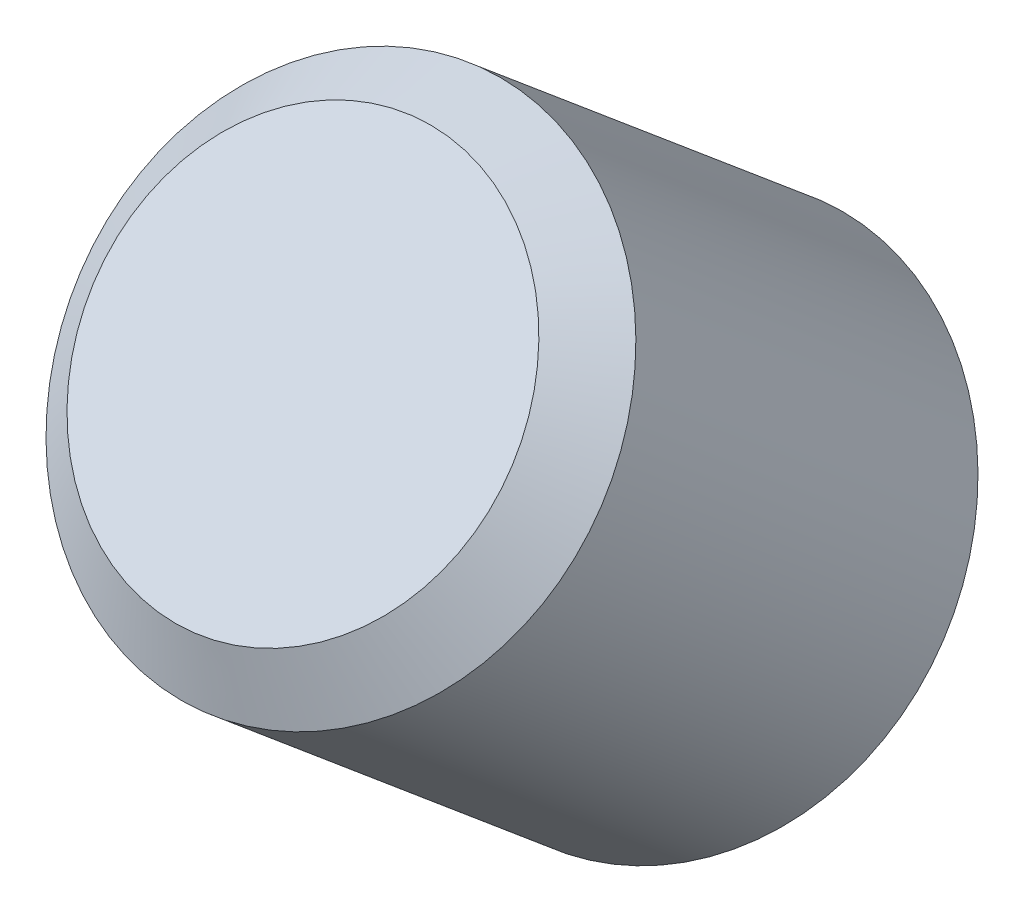
ISO-10303-21;
HEADER;
FILE_DESCRIPTION(('STEP AP214'),'2;1');
FILE_NAME('part.step','',(''),(''),'','','');
FILE_SCHEMA(('AUTOMOTIVE_DESIGN { 1 0 10303 214 1 1 1 1 }'));
ENDSEC;
DATA;
#1=APPLICATION_CONTEXT('core data for automotive mechanical design processes');
#2=APPLICATION_PROTOCOL_DEFINITION('international standard','automotive_design',2000,#1);
#3=PRODUCT_CONTEXT('',#1,'mechanical');
#4=PRODUCT('Part','Part','',(#3));
#5=PRODUCT_RELATED_PRODUCT_CATEGORY('part','',(#4));
#6=PRODUCT_DEFINITION_FORMATION('','',#4);
#7=PRODUCT_DEFINITION_CONTEXT('part definition',#1,'design');
#8=PRODUCT_DEFINITION('design','',#6,#7);
#9=PRODUCT_DEFINITION_SHAPE('','',#8);
#10=(LENGTH_UNIT() NAMED_UNIT(*) SI_UNIT(.MILLI.,.METRE.));
#11=(NAMED_UNIT(*) PLANE_ANGLE_UNIT() SI_UNIT($,.RADIAN.));
#12=(NAMED_UNIT(*) SI_UNIT($,.STERADIAN.) SOLID_ANGLE_UNIT());
#13=UNCERTAINTY_MEASURE_WITH_UNIT(LENGTH_MEASURE(1.E-05),#10,'distance_accuracy_value','');
#14=(GEOMETRIC_REPRESENTATION_CONTEXT(3) GLOBAL_UNCERTAINTY_ASSIGNED_CONTEXT((#13)) GLOBAL_UNIT_ASSIGNED_CONTEXT((#10,
#11,#12)) REPRESENTATION_CONTEXT('',''));
#15=CARTESIAN_POINT('',(0.,0.,0.));
#16=DIRECTION('',(0.,0.,1.));
#17=DIRECTION('',(1.,0.,0.));
#18=AXIS2_PLACEMENT_3D('',#15,#16,#17);
#19=CARTESIAN_POINT('',(37.1840011378351,58.5071937703798,-39.8184459232381));
#20=DIRECTION('',(0.,0.642787609686543,0.766044443118975));
#21=DIRECTION('',(0.,-0.766044443118975,0.642787609686543));
#22=AXIS2_PLACEMENT_3D('',#19,#20,#21);
#23=PLANE('',#22);
#24=CARTESIAN_POINT('',(37.1840011378351,58.5071937703798,-39.8184459232381));
#25=DIRECTION('',(0.,0.642787609686543,0.766044443118975));
#26=DIRECTION('',(0.,-0.766044443118975,0.642787609686543));
#27=AXIS2_PLACEMENT_3D('',#24,#25,#26);
#28=CIRCLE('',#27,3.99999999999999);
#29=CARTESIAN_POINT('',(37.1840011378351,55.4430159979039,-37.2472954844919));
#30=VERTEX_POINT('',#29);
#31=EDGE_CURVE('E59',#30,#30,#28,.F.);
#32=ORIENTED_EDGE('',*,*,#31,.T.);
#33=EDGE_LOOP('',(#32));
#34=FACE_BOUND('',#33,.T.);
#35=CARTESIAN_POINT('',(37.1840011378351,58.5071937703798,-39.8184459232381));
#36=DIRECTION('',(0.,0.642787609686543,0.766044443118975));
#37=DIRECTION('',(0.,-0.766044443118975,0.642787609686543));
#38=AXIS2_PLACEMENT_3D('',#35,#36,#37);
#39=CIRCLE('',#38,3.10000022417708);
#40=CARTESIAN_POINT('',(38.7840011378351,60.5411826203742,-41.5251652170871));
#41=VERTEX_POINT('',#40);
#42=CARTESIAN_POINT('',(38.7840011378351,56.4732049203854,-38.1117266293891));
#43=VERTEX_POINT('',#42);
#44=EDGE_CURVE('E76',#41,#43,#39,.T.);
#45=ORIENTED_EDGE('',*,*,#44,.T.);
#46=DIRECTION('',(0.,0.766044443118975,-0.642787609686543));
#47=VECTOR('',#46,1.);
#48=CARTESIAN_POINT('',(38.7840011378351,56.4732049203854,-38.1117266293891));
#49=LINE('',#48,#47);
#50=EDGE_CURVE('E87',#43,#41,#49,.T.);
#51=ORIENTED_EDGE('',*,*,#50,.T.);
#52=EDGE_LOOP('',(#45,#51));
#53=FACE_BOUND('',#52,.T.);
#54=ADVANCED_FACE('F49',(#34,#53),#23,.F.);
#55=CARTESIAN_POINT('',(37.1840011378351,64.9350698672452,-32.1580014920484));
#56=DIRECTION('',(0.,-0.642787609686543,-0.766044443118975));
#57=DIRECTION('',(0.,0.766044443118975,-0.642787609686543));
#58=AXIS2_PLACEMENT_3D('',#55,#56,#57);
#59=CYLINDRICAL_SURFACE('',#58,5.);
#60=CARTESIAN_POINT('',(37.1840011378351,59.1499813800663,-39.0524014801191));
#61=DIRECTION('',(0.,0.642787609686544,0.766044443118974));
#62=DIRECTION('',(0.,-0.766044443118974,0.642787609686544));
#63=AXIS2_PLACEMENT_3D('',#60,#61,#62);
#64=CIRCLE('',#63,5.);
#65=CARTESIAN_POINT('',(37.1840011378351,55.3197591644715,-35.8384634316864));
#66=VERTEX_POINT('',#65);
#67=EDGE_CURVE('E108',#66,#66,#64,.T.);
#68=ORIENTED_EDGE('',*,*,#67,.T.);
#69=EDGE_LOOP('',(#68));
#70=FACE_BOUND('',#69,.T.);
#71=CARTESIAN_POINT('',(37.1840011378351,64.9350698672453,-32.1580014920483));
#72=DIRECTION('',(0.,0.642787609686543,0.766044443118975));
#73=DIRECTION('',(0.,-0.766044443118975,0.642787609686543));
#74=AXIS2_PLACEMENT_3D('',#71,#72,#73);
#75=CIRCLE('',#74,5.);
#76=CARTESIAN_POINT('',(37.1840011378351,68.7652920828402,-35.371939540481));
#77=VERTEX_POINT('',#76);
#78=EDGE_CURVE('E100',#77,#77,#75,.F.);
#79=ORIENTED_EDGE('',*,*,#78,.T.);
#80=EDGE_LOOP('',(#79));
#81=FACE_BOUND('',#80,.T.);
#82=ADVANCED_FACE('F124',(#70,#81),#59,.T.);
#83=CARTESIAN_POINT('',(37.1840011378351,64.9350698672452,-32.1580014920484));
#84=DIRECTION('',(0.,-0.642787609686543,-0.766044443118975));
#85=DIRECTION('',(0.,0.766044443118975,-0.642787609686543));
#86=AXIS2_PLACEMENT_3D('',#83,#84,#85);
#87=CYLINDRICAL_SURFACE('',#86,3.10000022417708);
#88=ORIENTED_EDGE('',*,*,#44,.F.);
#89=DIRECTION('',(0.,-0.642787609686543,-0.766044443118975));
#90=VECTOR('',#89,1.);
#91=CARTESIAN_POINT('',(38.7840011378351,66.9690587172396,-33.8647207858974));
#92=LINE('',#91,#90);
#93=CARTESIAN_POINT('',(38.7840011378351,66.9690587172396,-33.8647207858974));
#94=VERTEX_POINT('',#93);
#95=EDGE_CURVE('E91',#94,#41,#92,.T.);
#96=ORIENTED_EDGE('',*,*,#95,.F.);
#97=CARTESIAN_POINT('',(37.1840011378351,64.9350698672452,-32.1580014920484));
#98=DIRECTION('',(0.,0.642787609686543,0.766044443118975));
#99=DIRECTION('',(0.,-0.766044443118975,0.642787609686543));
#100=AXIS2_PLACEMENT_3D('',#97,#98,#99);
#101=CIRCLE('',#100,3.10000022417708);
#102=CARTESIAN_POINT('',(38.7840011378351,62.9010810172509,-30.4512821981994));
#103=VERTEX_POINT('',#102);
#104=EDGE_CURVE('E84',#94,#103,#101,.T.);
#105=ORIENTED_EDGE('',*,*,#104,.T.);
#106=DIRECTION('',(0.,-0.642787609686543,-0.766044443118975));
#107=VECTOR('',#106,1.);
#108=CARTESIAN_POINT('',(38.7840011378351,62.9010810172509,-30.4512821981994));
#109=LINE('',#108,#107);
#110=EDGE_CURVE('E93',#103,#43,#109,.T.);
#111=ORIENTED_EDGE('',*,*,#110,.T.);
#112=EDGE_LOOP('',(#88,#96,#105,#111));
#113=FACE_BOUND('',#112,.T.);
#114=ADVANCED_FACE('F96',(#113),#87,.F.);
#115=CARTESIAN_POINT('',(38.7840011378351,62.9010810172509,-30.4512821981994));
#116=DIRECTION('',(-1.,0.,0.));
#117=DIRECTION('',(0.,0.,1.));
#118=AXIS2_PLACEMENT_3D('',#115,#116,#117);
#119=PLANE('',#118);
#120=ORIENTED_EDGE('',*,*,#50,.F.);
#121=ORIENTED_EDGE('',*,*,#110,.F.);
#122=DIRECTION('',(0.,0.766044443118975,-0.642787609686543));
#123=VECTOR('',#122,1.);
#124=CARTESIAN_POINT('',(38.7840011378351,62.9010810172509,-30.4512821981994));
#125=LINE('',#124,#123);
#126=EDGE_CURVE('E68',#103,#94,#125,.T.);
#127=ORIENTED_EDGE('',*,*,#126,.T.);
#128=ORIENTED_EDGE('',*,*,#95,.T.);
#129=EDGE_LOOP('',(#120,#121,#127,#128));
#130=FACE_BOUND('',#129,.T.);
#131=ADVANCED_FACE('F90',(#130),#119,.T.);
#132=CARTESIAN_POINT('',(37.1840011378351,64.9350698672452,-32.1580014920484));
#133=DIRECTION('',(0.,0.642787609686543,0.766044443118975));
#134=DIRECTION('',(0.,-0.766044443118975,0.642787609686543));
#135=AXIS2_PLACEMENT_3D('',#132,#133,#134);
#136=PLANE('',#135);
#137=ORIENTED_EDGE('',*,*,#126,.F.);
#138=ORIENTED_EDGE('',*,*,#104,.F.);
#139=EDGE_LOOP('',(#137,#138));
#140=FACE_BOUND('',#139,.T.);
#141=ADVANCED_FACE('F85',(#140),#136,.F.);
#142=CARTESIAN_POINT('',(37.1840011378351,65.5778574769318,-31.3919570489294));
#143=DIRECTION('',(0.,0.642787609686543,0.766044443118975));
#144=DIRECTION('',(0.,-0.766044443118975,0.642787609686543));
#145=AXIS2_PLACEMENT_3D('',#142,#143,#144);
#146=PLANE('',#145);
#147=CARTESIAN_POINT('',(37.1840011378351,65.5778574769318,-31.3919570489294));
#148=DIRECTION('',(0.,0.642787609686543,0.766044443118975));
#149=DIRECTION('',(0.,-0.766044443118975,0.642787609686543));
#150=AXIS2_PLACEMENT_3D('',#147,#148,#149);
#151=CIRCLE('',#150,4.00000000000015);
#152=CARTESIAN_POINT('',(37.1840011378351,68.6420352494078,-33.9631074876757));
#153=VERTEX_POINT('',#152);
#154=EDGE_CURVE('E11',#153,#153,#151,.T.);
#155=ORIENTED_EDGE('',*,*,#154,.T.);
#156=EDGE_LOOP('',(#155));
#157=FACE_BOUND('',#156,.T.);
#158=ADVANCED_FACE('F121',(#157),#146,.T.);
#159=CARTESIAN_POINT('',(37.1840011378351,59.1499813800663,-39.0524014801191));
#160=DIRECTION('',(0.,0.642787609686544,0.766044443118974));
#161=DIRECTION('',(0.,-0.766044443118974,0.642787609686544));
#162=AXIS2_PLACEMENT_3D('',#159,#160,#161);
#163=CONICAL_SURFACE('',#162,5.,0.785398163397452);
#164=ORIENTED_EDGE('',*,*,#31,.F.);
#165=EDGE_LOOP('',(#164));
#166=FACE_BOUND('',#165,.T.);
#167=ORIENTED_EDGE('',*,*,#67,.F.);
#168=EDGE_LOOP('',(#167));
#169=FACE_BOUND('',#168,.T.);
#170=ADVANCED_FACE('F118',(#166,#169),#163,.T.);
#171=CARTESIAN_POINT('',(37.1840011378351,65.5778574769318,-31.3919570489294));
#172=DIRECTION('',(0.,-0.642787609686543,-0.766044443118975));
#173=DIRECTION('',(0.,0.766044443118975,-0.642787609686543));
#174=AXIS2_PLACEMENT_3D('',#171,#172,#173);
#175=CONICAL_SURFACE('',#174,4.00000000000014,0.785398163397444);
#176=CARTESIAN_POINT('',(37.1840011378351,68.7652920828402,-35.371939540481));
#177=CARTESIAN_POINT('',(37.1840011378351,68.7640081574919,-35.3572642065976));
#178=CARTESIAN_POINT('',(37.1840011378351,68.7627242321437,-35.3425888727142));
#179=CARTESIAN_POINT('',(37.1840011378351,68.7601563814472,-35.3132382049474));
#180=CARTESIAN_POINT('',(37.1840011378351,68.7588724560989,-35.298562871064));
#181=CARTESIAN_POINT('',(37.1840011378351,68.7563046054024,-35.2692122032973));
#182=CARTESIAN_POINT('',(37.1840011378351,68.7550206800542,-35.2545368694139));
#183=CARTESIAN_POINT('',(37.1840011378351,68.7524528293576,-35.2251862016471));
#184=CARTESIAN_POINT('',(37.1840011378351,68.7511689040094,-35.2105108677637));
#185=CARTESIAN_POINT('',(37.1840011378351,68.7486010533129,-35.1811601999969));
#186=CARTESIAN_POINT('',(37.1840011378351,68.7473171279646,-35.1664848661135));
#187=CARTESIAN_POINT('',(37.1840011378351,68.7447492772681,-35.1371341983468));
#188=CARTESIAN_POINT('',(37.1840011378351,68.7434653519199,-35.1224588644634));
#189=CARTESIAN_POINT('',(37.1840011378351,68.7408975012233,-35.0931081966966));
#190=CARTESIAN_POINT('',(37.1840011378351,68.7396135758751,-35.0784328628132));
#191=CARTESIAN_POINT('',(37.1840011378351,68.7370457251786,-35.0490821950464));
#192=CARTESIAN_POINT('',(37.1840011378351,68.7357617998303,-35.034406861163));
#193=CARTESIAN_POINT('',(37.1840011378351,68.7331939491338,-35.0050561933963));
#194=CARTESIAN_POINT('',(37.1840011378351,68.7319100237856,-34.9903808595129));
#195=CARTESIAN_POINT('',(37.1840011378351,68.7293421730891,-34.9610301917461));
#196=CARTESIAN_POINT('',(37.1840011378351,68.7280582477408,-34.9463548578627));
#197=CARTESIAN_POINT('',(37.1840011378351,68.7254903970443,-34.9170041900959));
#198=CARTESIAN_POINT('',(37.1840011378351,68.724206471696,-34.9023288562125));
#199=CARTESIAN_POINT('',(37.1840011378351,68.7216386209995,-34.8729781884458));
#200=CARTESIAN_POINT('',(37.1840011378351,68.7203546956513,-34.8583028545624));
#201=CARTESIAN_POINT('',(37.1840011378351,68.7177868449548,-34.8289521867956));
#202=CARTESIAN_POINT('',(37.1840011378351,68.7165029196065,-34.8142768529122));
#203=CARTESIAN_POINT('',(37.1840011378351,68.71393506891,-34.7849261851454));
#204=CARTESIAN_POINT('',(37.1840011378351,68.7126511435618,-34.770250851262));
#205=CARTESIAN_POINT('',(37.1840011378351,68.7100832928653,-34.7409001834953));
#206=CARTESIAN_POINT('',(37.1840011378351,68.708799367517,-34.7262248496119));
#207=CARTESIAN_POINT('',(37.1840011378351,68.7062315168205,-34.6968741818451));
#208=CARTESIAN_POINT('',(37.1840011378351,68.7049475914722,-34.6821988479617));
#209=CARTESIAN_POINT('',(37.1840011378351,68.7023797407757,-34.6528481801949));
#210=CARTESIAN_POINT('',(37.1840011378351,68.7010958154275,-34.6381728463115));
#211=CARTESIAN_POINT('',(37.1840011378351,68.698527964731,-34.6088221785448));
#212=CARTESIAN_POINT('',(37.1840011378351,68.6972440393827,-34.5941468446614));
#213=CARTESIAN_POINT('',(37.1840011378351,68.6946761886862,-34.5647961768946));
#214=CARTESIAN_POINT('',(37.1840011378351,68.6933922633379,-34.5501208430112));
#215=CARTESIAN_POINT('',(37.1840011378351,68.6908244126414,-34.5207701752444));
#216=CARTESIAN_POINT('',(37.1840011378351,68.6895404872932,-34.506094841361));
#217=CARTESIAN_POINT('',(37.1840011378351,68.6869726365967,-34.4767441735943));
#218=CARTESIAN_POINT('',(37.1840011378351,68.6856887112484,-34.4620688397109));
#219=CARTESIAN_POINT('',(37.1840011378351,68.6831208605519,-34.4327181719441));
#220=CARTESIAN_POINT('',(37.1840011378351,68.6818369352036,-34.4180428380607));
#221=CARTESIAN_POINT('',(37.1840011378351,68.6792690845072,-34.3886921702939));
#222=CARTESIAN_POINT('',(37.1840011378351,68.6779851591589,-34.3740168364105));
#223=CARTESIAN_POINT('',(37.1840011378351,68.6754173084624,-34.3446661686438));
#224=CARTESIAN_POINT('',(37.1840011378351,68.6741333831141,-34.3299908347604));
#225=CARTESIAN_POINT('',(37.1840011378351,68.6715655324176,-34.3006401669936));
#226=CARTESIAN_POINT('',(37.1840011378351,68.6702816070694,-34.2859648331102));
#227=CARTESIAN_POINT('',(37.1840011378351,68.6677137563729,-34.2566141653434));
#228=CARTESIAN_POINT('',(37.1840011378351,68.6664298310246,-34.24193883146));
#229=CARTESIAN_POINT('',(37.1840011378351,68.6638619803281,-34.2125881636933));
#230=CARTESIAN_POINT('',(37.1840011378351,68.6625780549799,-34.1979128298099));
#231=CARTESIAN_POINT('',(37.1840011378351,68.6600102042833,-34.1685621620431));
#232=CARTESIAN_POINT('',(37.1840011378351,68.6587262789351,-34.1538868281597));
#233=CARTESIAN_POINT('',(37.1840011378351,68.6561584282386,-34.1245361603929));
#234=CARTESIAN_POINT('',(37.1840011378351,68.6548745028903,-34.1098608265095));
#235=CARTESIAN_POINT('',(37.1840011378351,68.6523066521938,-34.0805101587428));
#236=CARTESIAN_POINT('',(37.1840011378351,68.6510227268456,-34.0658348248594));
#237=CARTESIAN_POINT('',(37.1840011378351,68.648454876149,-34.0364841570926));
#238=CARTESIAN_POINT('',(37.1840011378351,68.6471709508008,-34.0218088232092));
#239=CARTESIAN_POINT('',(37.1840011378351,68.6446031001043,-33.9924581554424));
#240=CARTESIAN_POINT('',(37.1840011378351,68.643319174756,-33.9777828215591));
#241=CARTESIAN_POINT('',(37.1840011378351,68.6420352494078,-33.9631074876757));
#242=B_SPLINE_CURVE_WITH_KNOTS('',3,(#176,#177,#178,#179,#180,#181,#182,#183,#184,#185,#186,
#187,#188,#189,#190,#191,#192,#193,#194,#195,#196,#197,#198,#199,#200,#201,#202,#203,#204,#205,
#206,#207,#208,#209,#210,#211,#212,#213,#214,#215,#216,#217,#218,#219,#220,#221,#222,#223,#224,
#225,#226,#227,#228,#229,#230,#231,#232,#233,#234,#235,#236,#237,#238,#239,#240,#241),
.UNSPECIFIED.,.F.,.F.,(4,2,2,2,2,2,2,2,2,2,2,2,2,2,2,2,2,2,2,2,2,2,2,2,2,2,2,2,2,2,2,2,4),(0.,
0.0441941738241629,0.0883883476483108,0.132582521472466,0.176776695296615,0.220970869120769,
0.265165042944925,0.309359216769074,0.353553390593222,0.397747564417385,0.441941738241533,
0.486135912065681,0.530330085889837,0.574524259713993,0.618718433538141,0.662912607362297,
0.707106781186446,0.751300955010601,0.795495128834755,0.839689302658905,0.883883476483059,
0.928077650307215,0.972271824131364,1.01646599795552,1.06066017177967,1.10485434560381,
1.14904851942798,1.19324269325213,1.23743686707628,1.28163104090044,1.32582521472459,
1.37001938854873,1.41421356237289),.UNSPECIFIED.);
#243=EDGE_CURVE('BSEAM52',#77,#153,#242,.T.);
#244=ORIENTED_EDGE('',*,*,#78,.F.);
#245=ORIENTED_EDGE('',*,*,#154,.F.);
#246=ORIENTED_EDGE('',*,*,#243,.T.);
#247=ORIENTED_EDGE('',*,*,#243,.F.);
#248=EDGE_LOOP('',(#244,#246,#245,#247));
#249=FACE_BOUND('',#248,.T.);
#250=ADVANCED_FACE('F52',(#249),#175,.T.);
#251=CLOSED_SHELL('',(#54,#82,#114,#131,#141,#158,#170,#250));
#252=MANIFOLD_SOLID_BREP('B2',#251);
#253=ADVANCED_BREP_SHAPE_REPRESENTATION('',(#18,#252),#14);
#254=SHAPE_DEFINITION_REPRESENTATION(#9,#253);
ENDSEC;
END-ISO-10303-21;
